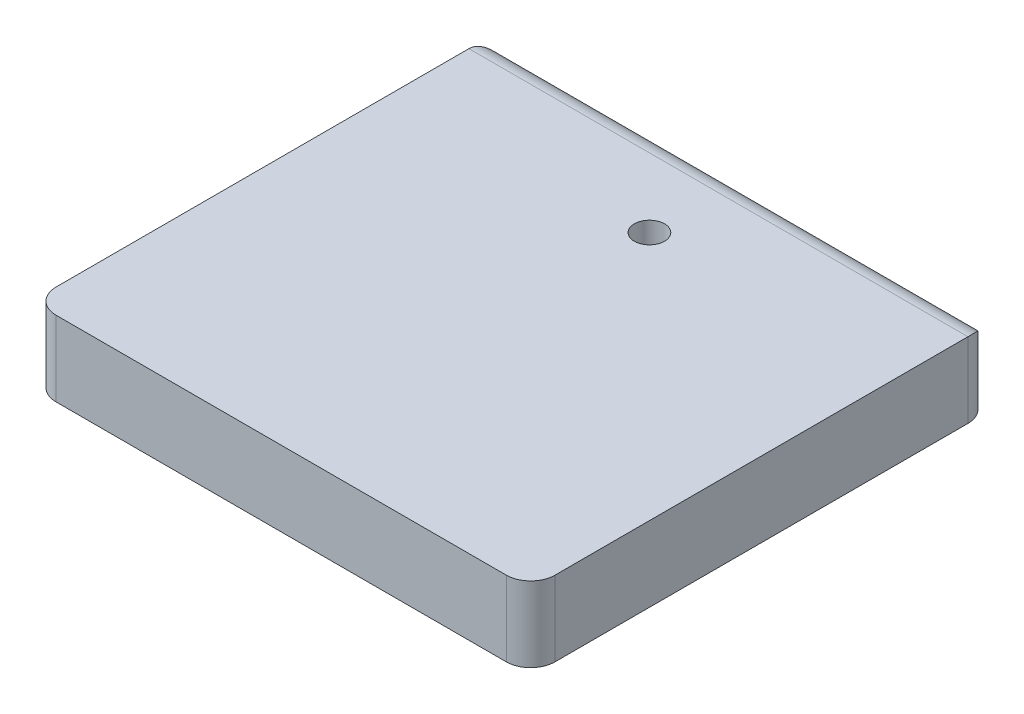
ISO-10303-21;
HEADER;
FILE_DESCRIPTION(('STEP AP214'),'2;1');
FILE_NAME('part.step','',(''),(''),'','','');
FILE_SCHEMA(('AUTOMOTIVE_DESIGN { 1 0 10303 214 1 1 1 1 }'));
ENDSEC;
DATA;
#1=APPLICATION_CONTEXT('core data for automotive mechanical design processes');
#2=APPLICATION_PROTOCOL_DEFINITION('international standard','automotive_design',2000,#1);
#3=PRODUCT_CONTEXT('',#1,'mechanical');
#4=PRODUCT('Part','Part','',(#3));
#5=PRODUCT_RELATED_PRODUCT_CATEGORY('part','',(#4));
#6=PRODUCT_DEFINITION_FORMATION('','',#4);
#7=PRODUCT_DEFINITION_CONTEXT('part definition',#1,'design');
#8=PRODUCT_DEFINITION('design','',#6,#7);
#9=PRODUCT_DEFINITION_SHAPE('','',#8);
#10=(LENGTH_UNIT() NAMED_UNIT(*) SI_UNIT(.MILLI.,.METRE.));
#11=(NAMED_UNIT(*) PLANE_ANGLE_UNIT() SI_UNIT($,.RADIAN.));
#12=(NAMED_UNIT(*) SI_UNIT($,.STERADIAN.) SOLID_ANGLE_UNIT());
#13=UNCERTAINTY_MEASURE_WITH_UNIT(LENGTH_MEASURE(1.E-05),#10,'distance_accuracy_value','');
#14=(GEOMETRIC_REPRESENTATION_CONTEXT(3) GLOBAL_UNCERTAINTY_ASSIGNED_CONTEXT((#13)) GLOBAL_UNIT_ASSIGNED_CONTEXT((#10,
#11,#12)) REPRESENTATION_CONTEXT('',''));
#15=CARTESIAN_POINT('',(0.,0.,0.));
#16=DIRECTION('',(0.,0.,1.));
#17=DIRECTION('',(1.,0.,0.));
#18=AXIS2_PLACEMENT_3D('',#15,#16,#17);
#19=CARTESIAN_POINT('',(0.,7.8232,0.));
#20=DIRECTION('',(1.,0.,0.));
#21=DIRECTION('',(0.,0.,-1.));
#22=AXIS2_PLACEMENT_3D('',#19,#20,#21);
#23=PLANE('',#22);
#24=DIRECTION('',(0.,0.,1.));
#25=VECTOR('',#24,1.);
#26=CARTESIAN_POINT('',(0.,0.,0.));
#27=LINE('',#26,#25);
#28=CARTESIAN_POINT('',(0.,0.,-45.5422));
#29=VERTEX_POINT('',#28);
#30=CARTESIAN_POINT('',(0.,0.,-2.54));
#31=VERTEX_POINT('',#30);
#32=EDGE_CURVE('E134',#29,#31,#27,.T.);
#33=ORIENTED_EDGE('',*,*,#32,.T.);
#34=DIRECTION('',(0.,-1.,0.));
#35=VECTOR('',#34,1.);
#36=CARTESIAN_POINT('',(0.,7.8232,-2.54));
#37=LINE('',#36,#35);
#38=CARTESIAN_POINT('',(0.,7.8232,-2.54));
#39=VERTEX_POINT('',#38);
#40=EDGE_CURVE('E153',#31,#39,#37,.F.);
#41=ORIENTED_EDGE('',*,*,#40,.T.);
#42=DIRECTION('',(0.,0.,1.));
#43=VECTOR('',#42,1.);
#44=CARTESIAN_POINT('',(0.,7.8232,0.));
#45=LINE('',#44,#43);
#46=CARTESIAN_POINT('',(0.,7.8232,-45.5422));
#47=VERTEX_POINT('',#46);
#48=EDGE_CURVE('E132',#47,#39,#45,.T.);
#49=ORIENTED_EDGE('',*,*,#48,.F.);
#50=DIRECTION('',(0.,-1.,0.));
#51=VECTOR('',#50,1.);
#52=CARTESIAN_POINT('',(0.,7.8232,-45.5422));
#53=LINE('',#52,#51);
#54=EDGE_CURVE('E150',#47,#29,#53,.T.);
#55=ORIENTED_EDGE('',*,*,#54,.T.);
#56=EDGE_LOOP('',(#33,#41,#49,#55));
#57=FACE_BOUND('',#56,.T.);
#58=ADVANCED_FACE('F36',(#57),#23,.F.);
#59=CARTESIAN_POINT('',(0.,7.8232,0.));
#60=DIRECTION('',(0.,0.,-1.));
#61=DIRECTION('',(-1.,0.,0.));
#62=AXIS2_PLACEMENT_3D('',#59,#60,#61);
#63=PLANE('',#62);
#64=DIRECTION('',(1.,0.,0.));
#65=VECTOR('',#64,1.);
#66=CARTESIAN_POINT('',(0.,0.,0.));
#67=LINE('',#66,#65);
#68=CARTESIAN_POINT('',(2.54,0.,0.));
#69=VERTEX_POINT('',#68);
#70=CARTESIAN_POINT('',(49.4284,0.,0.));
#71=VERTEX_POINT('',#70);
#72=EDGE_CURVE('E129',#69,#71,#67,.T.);
#73=ORIENTED_EDGE('',*,*,#72,.T.);
#74=DIRECTION('',(0.,-1.,0.));
#75=VECTOR('',#74,1.);
#76=CARTESIAN_POINT('',(49.4284,7.8232,0.));
#77=LINE('',#76,#75);
#78=CARTESIAN_POINT('',(49.4284,7.8232,0.));
#79=VERTEX_POINT('',#78);
#80=EDGE_CURVE('E105',#71,#79,#77,.F.);
#81=ORIENTED_EDGE('',*,*,#80,.T.);
#82=DIRECTION('',(1.,0.,0.));
#83=VECTOR('',#82,1.);
#84=CARTESIAN_POINT('',(0.,7.8232,0.));
#85=LINE('',#84,#83);
#86=CARTESIAN_POINT('',(2.54,7.8232,0.));
#87=VERTEX_POINT('',#86);
#88=EDGE_CURVE('E174',#87,#79,#85,.T.);
#89=ORIENTED_EDGE('',*,*,#88,.F.);
#90=DIRECTION('',(0.,-1.,0.));
#91=VECTOR('',#90,1.);
#92=CARTESIAN_POINT('',(2.54,7.8232,0.));
#93=LINE('',#92,#91);
#94=EDGE_CURVE('E110',#87,#69,#93,.T.);
#95=ORIENTED_EDGE('',*,*,#94,.T.);
#96=EDGE_LOOP('',(#73,#81,#89,#95));
#97=FACE_BOUND('',#96,.T.);
#98=ADVANCED_FACE('F189',(#97),#63,.F.);
#99=CARTESIAN_POINT('',(51.9684,7.8232,0.));
#100=DIRECTION('',(-1.,0.,0.));
#101=DIRECTION('',(0.,0.,1.));
#102=AXIS2_PLACEMENT_3D('',#99,#100,#101);
#103=PLANE('',#102);
#104=DIRECTION('',(0.,0.,-1.));
#105=VECTOR('',#104,1.);
#106=CARTESIAN_POINT('',(51.9684,7.8232,0.));
#107=LINE('',#106,#105);
#108=CARTESIAN_POINT('',(51.9684,7.8232,-2.54));
#109=VERTEX_POINT('',#108);
#110=CARTESIAN_POINT('',(51.9684,7.8232,-45.5422));
#111=VERTEX_POINT('',#110);
#112=EDGE_CURVE('E121',#109,#111,#107,.T.);
#113=ORIENTED_EDGE('',*,*,#112,.F.);
#114=DIRECTION('',(0.,-1.,0.));
#115=VECTOR('',#114,1.);
#116=CARTESIAN_POINT('',(51.9684,7.8232,-2.54));
#117=LINE('',#116,#115);
#118=CARTESIAN_POINT('',(51.9684,0.,-2.54));
#119=VERTEX_POINT('',#118);
#120=EDGE_CURVE('E104',#109,#119,#117,.T.);
#121=ORIENTED_EDGE('',*,*,#120,.T.);
#122=DIRECTION('',(0.,0.,-1.));
#123=VECTOR('',#122,1.);
#124=CARTESIAN_POINT('',(51.9684,0.,0.));
#125=LINE('',#124,#123);
#126=CARTESIAN_POINT('',(51.9684,0.,-45.5422));
#127=VERTEX_POINT('',#126);
#128=EDGE_CURVE('E118',#119,#127,#125,.T.);
#129=ORIENTED_EDGE('',*,*,#128,.T.);
#130=DIRECTION('',(0.,-1.,0.));
#131=VECTOR('',#130,1.);
#132=CARTESIAN_POINT('',(51.9684,7.8232,-45.5422));
#133=LINE('',#132,#131);
#134=EDGE_CURVE('E123',#127,#111,#133,.F.);
#135=ORIENTED_EDGE('',*,*,#134,.T.);
#136=EDGE_LOOP('',(#113,#121,#129,#135));
#137=FACE_BOUND('',#136,.T.);
#138=ADVANCED_FACE('F116',(#137),#103,.F.);
#139=CARTESIAN_POINT('',(0.,7.8232,-48.0822));
#140=DIRECTION('',(0.,0.,1.));
#141=DIRECTION('',(1.,0.,0.));
#142=AXIS2_PLACEMENT_3D('',#139,#140,#141);
#143=PLANE('',#142);
#144=DIRECTION('',(0.,-1.,0.));
#145=VECTOR('',#144,1.);
#146=CARTESIAN_POINT('',(2.54,7.8232,-48.0822));
#147=LINE('',#146,#145);
#148=CARTESIAN_POINT('',(2.54,0.,-48.0822));
#149=VERTEX_POINT('',#148);
#150=CARTESIAN_POINT('',(2.54,5.2832,-48.0822));
#151=VERTEX_POINT('',#150);
#152=EDGE_CURVE('E157',#149,#151,#147,.F.);
#153=ORIENTED_EDGE('',*,*,#152,.T.);
#154=DIRECTION('',(-1.,0.,0.));
#155=VECTOR('',#154,1.);
#156=CARTESIAN_POINT('',(0.,5.2832,-48.0822));
#157=LINE('',#156,#155);
#158=CARTESIAN_POINT('',(49.4284,5.2832,-48.0822));
#159=VERTEX_POINT('',#158);
#160=EDGE_CURVE('E44',#151,#159,#157,.F.);
#161=ORIENTED_EDGE('',*,*,#160,.T.);
#162=DIRECTION('',(0.,-1.,0.));
#163=VECTOR('',#162,1.);
#164=CARTESIAN_POINT('',(49.4284,7.8232,-48.0822));
#165=LINE('',#164,#163);
#166=CARTESIAN_POINT('',(49.4284,0.,-48.0822));
#167=VERTEX_POINT('',#166);
#168=EDGE_CURVE('E155',#159,#167,#165,.T.);
#169=ORIENTED_EDGE('',*,*,#168,.T.);
#170=DIRECTION('',(-1.,0.,0.));
#171=VECTOR('',#170,1.);
#172=CARTESIAN_POINT('',(0.,0.,-48.0822));
#173=LINE('',#172,#171);
#174=EDGE_CURVE('E128',#167,#149,#173,.T.);
#175=ORIENTED_EDGE('',*,*,#174,.T.);
#176=EDGE_LOOP('',(#153,#161,#169,#175));
#177=FACE_BOUND('',#176,.T.);
#178=ADVANCED_FACE('F177',(#177),#143,.F.);
#179=CARTESIAN_POINT('',(0.,7.8232,0.));
#180=DIRECTION('',(0.,-1.,0.));
#181=DIRECTION('',(0.,0.,-1.));
#182=AXIS2_PLACEMENT_3D('',#179,#180,#181);
#183=PLANE('',#182);
#184=CARTESIAN_POINT('',(25.9842,7.8232,-38.354));
#185=DIRECTION('',(0.,1.,0.));
#186=DIRECTION('',(0.,0.,1.));
#187=AXIS2_PLACEMENT_3D('',#184,#185,#186);
#188=CIRCLE('',#187,1.5748);
#189=CARTESIAN_POINT('',(25.9842,7.8232,-36.7792));
#190=VERTEX_POINT('',#189);
#191=EDGE_CURVE('E285',#190,#190,#188,.T.);
#192=ORIENTED_EDGE('',*,*,#191,.F.);
#193=EDGE_LOOP('',(#192));
#194=FACE_BOUND('',#193,.T.);
#195=ORIENTED_EDGE('',*,*,#112,.T.);
#196=DIRECTION('',(-1.,0.,0.));
#197=VECTOR('',#196,1.);
#198=CARTESIAN_POINT('',(0.,7.8232,-45.5422));
#199=LINE('',#198,#197);
#200=EDGE_CURVE('E159',#111,#47,#199,.T.);
#201=ORIENTED_EDGE('',*,*,#200,.T.);
#202=ORIENTED_EDGE('',*,*,#48,.T.);
#203=CARTESIAN_POINT('',(2.54,7.8232,-2.54));
#204=DIRECTION('',(0.,-1.,0.));
#205=DIRECTION('',(0.,0.,-1.));
#206=AXIS2_PLACEMENT_3D('',#203,#204,#205);
#207=CIRCLE('',#206,2.54);
#208=EDGE_CURVE('E146',#39,#87,#207,.F.);
#209=ORIENTED_EDGE('',*,*,#208,.T.);
#210=ORIENTED_EDGE('',*,*,#88,.T.);
#211=CARTESIAN_POINT('',(49.4284,7.8232,-2.54));
#212=DIRECTION('',(0.,-1.,0.));
#213=DIRECTION('',(0.,0.,-1.));
#214=AXIS2_PLACEMENT_3D('',#211,#212,#213);
#215=CIRCLE('',#214,2.54);
#216=EDGE_CURVE('E148',#79,#109,#215,.F.);
#217=ORIENTED_EDGE('',*,*,#216,.T.);
#218=EDGE_LOOP('',(#195,#201,#202,#209,#210,#217));
#219=FACE_BOUND('',#218,.T.);
#220=ADVANCED_FACE('F166',(#194,#219),#183,.F.);
#221=CARTESIAN_POINT('',(0.,0.,0.));
#222=DIRECTION('',(0.,-1.,0.));
#223=DIRECTION('',(0.,0.,-1.));
#224=AXIS2_PLACEMENT_3D('',#221,#222,#223);
#225=PLANE('',#224);
#226=CARTESIAN_POINT('',(25.9842,0.,-38.354));
#227=DIRECTION('',(0.,1.,0.));
#228=DIRECTION('',(0.,0.,1.));
#229=AXIS2_PLACEMENT_3D('',#226,#227,#228);
#230=CIRCLE('',#229,1.5748);
#231=CARTESIAN_POINT('',(25.9842,0.,-36.7792));
#232=VERTEX_POINT('',#231);
#233=EDGE_CURVE('E284',#232,#232,#230,.T.);
#234=ORIENTED_EDGE('',*,*,#233,.T.);
#235=EDGE_LOOP('',(#234));
#236=FACE_BOUND('',#235,.T.);
#237=ORIENTED_EDGE('',*,*,#128,.F.);
#238=CARTESIAN_POINT('',(49.4284,0.,-2.54));
#239=DIRECTION('',(0.,-1.,0.));
#240=DIRECTION('',(0.,0.,-1.));
#241=AXIS2_PLACEMENT_3D('',#238,#239,#240);
#242=CIRCLE('',#241,2.54);
#243=EDGE_CURVE('E100',#119,#71,#242,.T.);
#244=ORIENTED_EDGE('',*,*,#243,.T.);
#245=ORIENTED_EDGE('',*,*,#72,.F.);
#246=CARTESIAN_POINT('',(2.54,0.,-2.54));
#247=DIRECTION('',(0.,-1.,0.));
#248=DIRECTION('',(0.,0.,-1.));
#249=AXIS2_PLACEMENT_3D('',#246,#247,#248);
#250=CIRCLE('',#249,2.54);
#251=EDGE_CURVE('E111',#69,#31,#250,.T.);
#252=ORIENTED_EDGE('',*,*,#251,.T.);
#253=ORIENTED_EDGE('',*,*,#32,.F.);
#254=CARTESIAN_POINT('',(2.54,0.,-45.5422));
#255=DIRECTION('',(0.,-1.,0.));
#256=DIRECTION('',(0.,0.,-1.));
#257=AXIS2_PLACEMENT_3D('',#254,#255,#256);
#258=CIRCLE('',#257,2.54);
#259=EDGE_CURVE('E140',#29,#149,#258,.T.);
#260=ORIENTED_EDGE('',*,*,#259,.T.);
#261=ORIENTED_EDGE('',*,*,#174,.F.);
#262=CARTESIAN_POINT('',(49.4284,0.,-45.5422));
#263=DIRECTION('',(0.,-1.,0.));
#264=DIRECTION('',(0.,0.,-1.));
#265=AXIS2_PLACEMENT_3D('',#262,#263,#264);
#266=CIRCLE('',#265,2.54);
#267=EDGE_CURVE('E122',#167,#127,#266,.T.);
#268=ORIENTED_EDGE('',*,*,#267,.T.);
#269=EDGE_LOOP('',(#237,#244,#245,#252,#253,#260,#261,#268));
#270=FACE_BOUND('',#269,.T.);
#271=ADVANCED_FACE('F125',(#236,#270),#225,.T.);
#272=CARTESIAN_POINT('',(49.4284,7.8232,-2.54));
#273=DIRECTION('',(0.,-1.,0.));
#274=DIRECTION('',(0.,0.,-1.));
#275=AXIS2_PLACEMENT_3D('',#272,#273,#274);
#276=CYLINDRICAL_SURFACE('',#275,2.54);
#277=ORIENTED_EDGE('',*,*,#216,.F.);
#278=ORIENTED_EDGE('',*,*,#80,.F.);
#279=ORIENTED_EDGE('',*,*,#243,.F.);
#280=ORIENTED_EDGE('',*,*,#120,.F.);
#281=EDGE_LOOP('',(#277,#278,#279,#280));
#282=FACE_BOUND('',#281,.T.);
#283=ADVANCED_FACE('F103',(#282),#276,.T.);
#284=CARTESIAN_POINT('',(2.54,7.8232,-2.54));
#285=DIRECTION('',(0.,-1.,0.));
#286=DIRECTION('',(0.,0.,-1.));
#287=AXIS2_PLACEMENT_3D('',#284,#285,#286);
#288=CYLINDRICAL_SURFACE('',#287,2.54);
#289=ORIENTED_EDGE('',*,*,#208,.F.);
#290=ORIENTED_EDGE('',*,*,#40,.F.);
#291=ORIENTED_EDGE('',*,*,#251,.F.);
#292=ORIENTED_EDGE('',*,*,#94,.F.);
#293=EDGE_LOOP('',(#289,#290,#291,#292));
#294=FACE_BOUND('',#293,.T.);
#295=ADVANCED_FACE('F200',(#294),#288,.T.);
#296=CARTESIAN_POINT('',(2.54,7.8232,-45.5422));
#297=DIRECTION('',(0.,-1.,0.));
#298=DIRECTION('',(0.,0.,-1.));
#299=AXIS2_PLACEMENT_3D('',#296,#297,#298);
#300=CYLINDRICAL_SURFACE('',#299,2.54);
#301=ORIENTED_EDGE('',*,*,#54,.F.);
#302=CARTESIAN_POINT('',(2.54,5.2832,-45.5422));
#303=DIRECTION('',(-0.707106781186547,-0.707106781186547,0.));
#304=DIRECTION('',(0.707106781186547,-0.707106781186547,0.));
#305=AXIS2_PLACEMENT_3D('',#302,#303,#304);
#306=ELLIPSE('',#305,3.59210244842766,2.54);
#307=EDGE_CURVE('E58',#47,#151,#306,.T.);
#308=ORIENTED_EDGE('',*,*,#307,.T.);
#309=ORIENTED_EDGE('',*,*,#152,.F.);
#310=ORIENTED_EDGE('',*,*,#259,.F.);
#311=EDGE_LOOP('',(#301,#308,#309,#310));
#312=FACE_BOUND('',#311,.T.);
#313=ADVANCED_FACE('F176',(#312),#300,.T.);
#314=CARTESIAN_POINT('',(49.4284,7.8232,-45.5422));
#315=DIRECTION('',(0.,-1.,0.));
#316=DIRECTION('',(0.,0.,-1.));
#317=AXIS2_PLACEMENT_3D('',#314,#315,#316);
#318=CYLINDRICAL_SURFACE('',#317,2.54);
#319=ORIENTED_EDGE('',*,*,#168,.F.);
#320=CARTESIAN_POINT('',(49.4284,5.2832,-45.5422));
#321=DIRECTION('',(0.707106781186547,-0.707106781186547,0.));
#322=DIRECTION('',(-0.707106781186547,-0.707106781186547,0.));
#323=AXIS2_PLACEMENT_3D('',#320,#321,#322);
#324=ELLIPSE('',#323,3.59210244842766,2.54);
#325=EDGE_CURVE('E11',#159,#111,#324,.T.);
#326=ORIENTED_EDGE('',*,*,#325,.T.);
#327=ORIENTED_EDGE('',*,*,#134,.F.);
#328=ORIENTED_EDGE('',*,*,#267,.F.);
#329=EDGE_LOOP('',(#319,#326,#327,#328));
#330=FACE_BOUND('',#329,.T.);
#331=ADVANCED_FACE('F179',(#330),#318,.T.);
#332=CARTESIAN_POINT('',(0.,5.2832,-45.5422));
#333=DIRECTION('',(-1.,0.,0.));
#334=DIRECTION('',(0.,0.,1.));
#335=AXIS2_PLACEMENT_3D('',#332,#333,#334);
#336=CYLINDRICAL_SURFACE('',#335,2.54);
#337=ORIENTED_EDGE('',*,*,#325,.F.);
#338=ORIENTED_EDGE('',*,*,#160,.F.);
#339=ORIENTED_EDGE('',*,*,#307,.F.);
#340=ORIENTED_EDGE('',*,*,#200,.F.);
#341=EDGE_LOOP('',(#337,#338,#339,#340));
#342=FACE_BOUND('',#341,.T.);
#343=ADVANCED_FACE('F38',(#342),#336,.T.);
#344=CARTESIAN_POINT('',(25.9842,0.,-38.354));
#345=DIRECTION('',(0.,1.,0.));
#346=DIRECTION('',(0.,0.,1.));
#347=AXIS2_PLACEMENT_3D('',#344,#345,#346);
#348=CYLINDRICAL_SURFACE('',#347,1.5748);
#349=ORIENTED_EDGE('',*,*,#233,.F.);
#350=EDGE_LOOP('',(#349));
#351=FACE_BOUND('',#350,.T.);
#352=ORIENTED_EDGE('',*,*,#191,.T.);
#353=EDGE_LOOP('',(#352));
#354=FACE_BOUND('',#353,.T.);
#355=ADVANCED_FACE('F181',(#351,#354),#348,.F.);
#356=CLOSED_SHELL('',(#58,#98,#138,#178,#220,#271,#283,#295,#313,#331,#343,#355));
#357=MANIFOLD_SOLID_BREP('B2',#356);
#358=ADVANCED_BREP_SHAPE_REPRESENTATION('',(#18,#357),#14);
#359=SHAPE_DEFINITION_REPRESENTATION(#9,#358);
ENDSEC;
END-ISO-10303-21;
